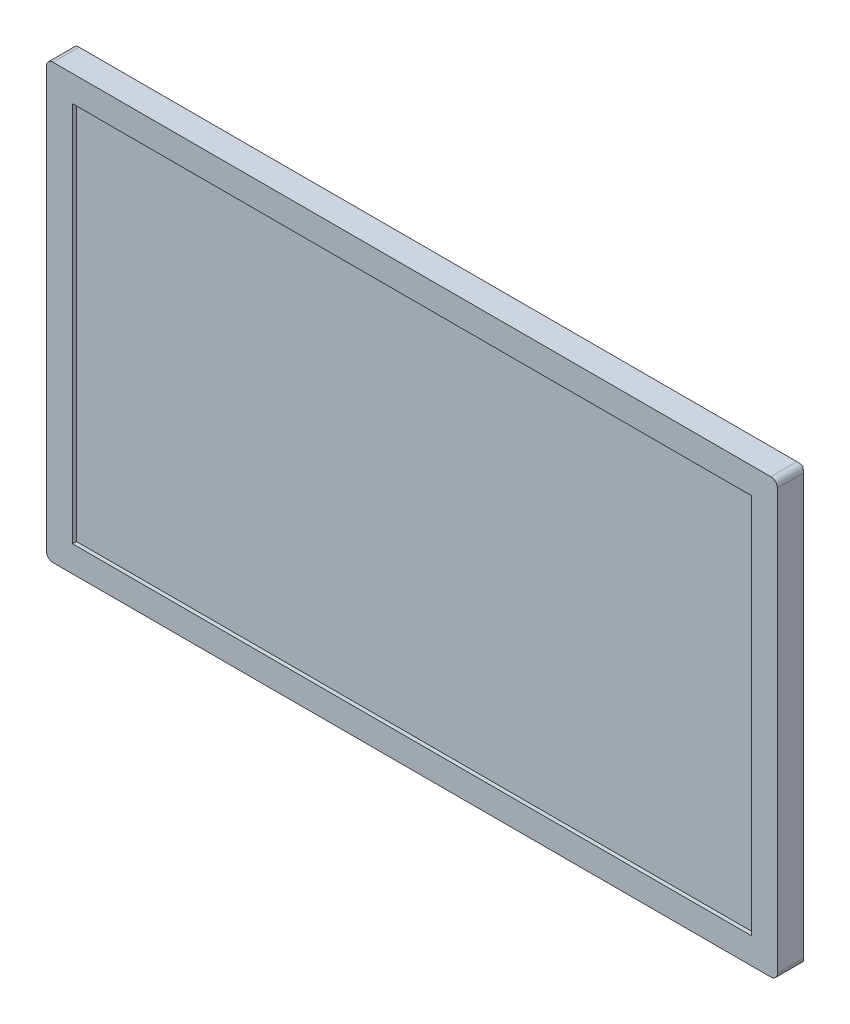
ISO-10303-21;
HEADER;
FILE_DESCRIPTION(('STEP AP214'),'2;1');
FILE_NAME('part.step','',(''),(''),'','','');
FILE_SCHEMA(('AUTOMOTIVE_DESIGN { 1 0 10303 214 1 1 1 1 }'));
ENDSEC;
DATA;
#1=APPLICATION_CONTEXT('core data for automotive mechanical design processes');
#2=APPLICATION_PROTOCOL_DEFINITION('international standard','automotive_design',2000,#1);
#3=PRODUCT_CONTEXT('',#1,'mechanical');
#4=PRODUCT('Part','Part','',(#3));
#5=PRODUCT_RELATED_PRODUCT_CATEGORY('part','',(#4));
#6=PRODUCT_DEFINITION_FORMATION('','',#4);
#7=PRODUCT_DEFINITION_CONTEXT('part definition',#1,'design');
#8=PRODUCT_DEFINITION('design','',#6,#7);
#9=PRODUCT_DEFINITION_SHAPE('','',#8);
#10=(LENGTH_UNIT() NAMED_UNIT(*) SI_UNIT(.MILLI.,.METRE.));
#11=(NAMED_UNIT(*) PLANE_ANGLE_UNIT() SI_UNIT($,.RADIAN.));
#12=(NAMED_UNIT(*) SI_UNIT($,.STERADIAN.) SOLID_ANGLE_UNIT());
#13=UNCERTAINTY_MEASURE_WITH_UNIT(LENGTH_MEASURE(1.E-05),#10,'distance_accuracy_value','');
#14=(GEOMETRIC_REPRESENTATION_CONTEXT(3) GLOBAL_UNCERTAINTY_ASSIGNED_CONTEXT((#13)) GLOBAL_UNIT_ASSIGNED_CONTEXT((#10,
#11,#12)) REPRESENTATION_CONTEXT('',''));
#15=CARTESIAN_POINT('',(0.,0.,0.));
#16=DIRECTION('',(0.,0.,1.));
#17=DIRECTION('',(1.,0.,0.));
#18=AXIS2_PLACEMENT_3D('',#15,#16,#17);
#19=CARTESIAN_POINT('',(4.24099625422855E-06,249.816192250166,87.3092256012788));
#20=DIRECTION('',(0.,0.,-1.));
#21=DIRECTION('',(0.,1.,0.));
#22=AXIS2_PLACEMENT_3D('',#19,#20,#21);
#23=PLANE('',#22);
#24=DIRECTION('',(0.,-1.,0.));
#25=VECTOR('',#24,1.);
#26=CARTESIAN_POINT('',(25.,201.522907005615,87.3092256012788));
#27=LINE('',#26,#25);
#28=CARTESIAN_POINT('',(25.,201.522907005615,87.3092256012788));
#29=VERTEX_POINT('',#28);
#30=CARTESIAN_POINT('',(25.0000000000001,121.522907005615,87.3092256012788));
#31=VERTEX_POINT('',#30);
#32=EDGE_CURVE('E53',#29,#31,#27,.T.);
#33=ORIENTED_EDGE('',*,*,#32,.F.);
#34=DIRECTION('',(1.,0.,0.));
#35=VECTOR('',#34,1.);
#36=CARTESIAN_POINT('',(25.,201.522907005615,87.3092256012788));
#37=LINE('',#36,#35);
#38=CARTESIAN_POINT('',(-25.,201.522907005615,87.3092256012788));
#39=VERTEX_POINT('',#38);
#40=EDGE_CURVE('E193',#39,#29,#37,.T.);
#41=ORIENTED_EDGE('',*,*,#40,.F.);
#42=DIRECTION('',(0.,1.,0.));
#43=VECTOR('',#42,1.);
#44=CARTESIAN_POINT('',(-25.,201.522907005615,87.3092256012788));
#45=LINE('',#44,#43);
#46=CARTESIAN_POINT('',(-25.,121.522907005615,87.3092256012788));
#47=VERTEX_POINT('',#46);
#48=EDGE_CURVE('E368',#47,#39,#45,.T.);
#49=ORIENTED_EDGE('',*,*,#48,.F.);
#50=DIRECTION('',(1.,0.,0.));
#51=VECTOR('',#50,1.);
#52=CARTESIAN_POINT('',(-314.999995759004,121.522907005615,87.3092256012789));
#53=LINE('',#52,#51);
#54=CARTESIAN_POINT('',(-256.543281003554,121.522907005615,87.3092256012789));
#55=VERTEX_POINT('',#54);
#56=EDGE_CURVE('E298',#55,#47,#53,.T.);
#57=ORIENTED_EDGE('',*,*,#56,.F.);
#58=DIRECTION('',(0.,1.,0.));
#59=VECTOR('',#58,1.);
#60=CARTESIAN_POINT('',(-256.543281003554,436.566192250166,87.3092256012789));
#61=LINE('',#60,#59);
#62=CARTESIAN_POINT('',(-256.543281003555,378.109477494716,87.3092256012789));
#63=VERTEX_POINT('',#62);
#64=EDGE_CURVE('E196',#63,#55,#61,.F.);
#65=ORIENTED_EDGE('',*,*,#64,.F.);
#66=DIRECTION('',(1.,0.,0.));
#67=VECTOR('',#66,1.);
#68=CARTESIAN_POINT('',(315.000004240996,378.109477494716,87.3092256012789));
#69=LINE('',#68,#67);
#70=CARTESIAN_POINT('',(256.543289485547,378.109477494716,87.3092256012789));
#71=VERTEX_POINT('',#70);
#72=EDGE_CURVE('E284',#71,#63,#69,.F.);
#73=ORIENTED_EDGE('',*,*,#72,.F.);
#74=DIRECTION('',(0.,1.,0.));
#75=VECTOR('',#74,1.);
#76=CARTESIAN_POINT('',(256.543289485547,63.0661922501656,87.3092256012789));
#77=LINE('',#76,#75);
#78=CARTESIAN_POINT('',(256.543289485547,121.522907005615,87.3092256012789));
#79=VERTEX_POINT('',#78);
#80=EDGE_CURVE('E290',#79,#71,#77,.T.);
#81=ORIENTED_EDGE('',*,*,#80,.F.);
#82=EDGE_CURVE('E39',#31,#79,#53,.T.);
#83=ORIENTED_EDGE('',*,*,#82,.F.);
#84=EDGE_LOOP('',(#33,#41,#49,#57,#65,#73,#81,#83));
#85=FACE_BOUND('',#84,.T.);
#86=ADVANCED_FACE('F36',(#85),#23,.T.);
#87=CARTESIAN_POINT('',(-314.999995759004,436.566192250166,121.059225601279));
#88=DIRECTION('',(-0.5,0.,-0.866025403784439));
#89=DIRECTION('',(-0.866025403784439,0.,0.5));
#90=AXIS2_PLACEMENT_3D('',#87,#88,#89);
#91=PLANE('',#90);
#92=CARTESIAN_POINT('',(-309.374995759004,68.6911922501657,117.811630337087));
#93=DIRECTION('',(-0.5,0.,-0.866025403784439));
#94=DIRECTION('',(-0.866025403784439,0.,0.5));
#95=AXIS2_PLACEMENT_3D('',#92,#93,#94);
#96=ELLIPSE('',#95,6.49519052838329,5.625);
#97=CARTESIAN_POINT('',(-314.999995759004,68.6911922501657,121.059225601279));
#98=VERTEX_POINT('',#97);
#99=CARTESIAN_POINT('',(-313.352471403178,64.7137166059914,120.108026970946));
#100=VERTEX_POINT('',#99);
#101=EDGE_CURVE('E275',#98,#100,#96,.F.);
#102=ORIENTED_EDGE('',*,*,#101,.F.);
#103=DIRECTION('',(0.,1.,0.));
#104=VECTOR('',#103,1.);
#105=CARTESIAN_POINT('',(-314.999995759004,249.816192250166,121.059225601279));
#106=LINE('',#105,#104);
#107=CARTESIAN_POINT('',(-314.999995759004,430.941192250166,121.059225601279));
#108=VERTEX_POINT('',#107);
#109=EDGE_CURVE('E276',#108,#98,#106,.F.);
#110=ORIENTED_EDGE('',*,*,#109,.F.);
#111=CARTESIAN_POINT('',(-309.374995759004,430.941192250166,117.811630337087));
#112=DIRECTION('',(-0.5,0.,-0.866025403784439));
#113=DIRECTION('',(0.866025403784439,0.,-0.5));
#114=AXIS2_PLACEMENT_3D('',#111,#112,#113);
#115=ELLIPSE('',#114,6.49519052838329,5.625);
#116=CARTESIAN_POINT('',(-313.352471403178,434.91866789434,120.108026970946));
#117=VERTEX_POINT('',#116);
#118=EDGE_CURVE('E283',#117,#108,#115,.F.);
#119=ORIENTED_EDGE('',*,*,#118,.F.);
#120=DIRECTION('',(-0.654653670707977,0.654653670707977,0.377964473009227));
#121=VECTOR('',#120,1.);
#122=CARTESIAN_POINT('',(-256.543281003555,378.109477494716,87.3092256012789));
#123=LINE('',#122,#121);
#124=EDGE_CURVE('E281',#63,#117,#123,.T.);
#125=ORIENTED_EDGE('',*,*,#124,.F.);
#126=ORIENTED_EDGE('',*,*,#64,.T.);
#127=DIRECTION('',(0.654653670707979,0.654653670707976,-0.377964473009226));
#128=VECTOR('',#127,1.);
#129=CARTESIAN_POINT('',(-313.352471403178,64.7137166059914,120.108026970946));
#130=LINE('',#129,#128);
#131=EDGE_CURVE('E199',#100,#55,#130,.T.);
#132=ORIENTED_EDGE('',*,*,#131,.F.);
#133=EDGE_LOOP('',(#102,#110,#119,#125,#126,#132));
#134=FACE_BOUND('',#133,.T.);
#135=ADVANCED_FACE('F345',(#134),#91,.T.);
#136=CARTESIAN_POINT('',(-314.999995759004,63.0661922501656,121.059225601279));
#137=DIRECTION('',(0.,-0.5,-0.866025403784439));
#138=DIRECTION('',(0.,0.866025403784439,-0.5));
#139=AXIS2_PLACEMENT_3D('',#136,#137,#138);
#140=PLANE('',#139);
#141=ORIENTED_EDGE('',*,*,#131,.T.);
#142=ORIENTED_EDGE('',*,*,#56,.T.);
#143=DIRECTION('',(-1.,0.,0.));
#144=VECTOR('',#143,1.);
#145=CARTESIAN_POINT('',(25.,121.522907005615,87.3092256012787));
#146=LINE('',#145,#144);
#147=EDGE_CURVE('E371',#31,#47,#146,.T.);
#148=ORIENTED_EDGE('',*,*,#147,.F.);
#149=ORIENTED_EDGE('',*,*,#82,.T.);
#150=DIRECTION('',(-0.654653670707978,0.654653670707976,-0.377964473009228));
#151=VECTOR('',#150,1.);
#152=CARTESIAN_POINT('',(313.352479885171,64.7137166059912,120.108026970946));
#153=LINE('',#152,#151);
#154=CARTESIAN_POINT('',(313.352479885171,64.7137166059913,120.108026970946));
#155=VERTEX_POINT('',#154);
#156=EDGE_CURVE('E295',#155,#79,#153,.T.);
#157=ORIENTED_EDGE('',*,*,#156,.F.);
#158=CARTESIAN_POINT('',(309.375004240996,68.6911922501657,117.811630337087));
#159=DIRECTION('',(0.,-0.5,-0.866025403784439));
#160=DIRECTION('',(0.,0.866025403784439,-0.5));
#161=AXIS2_PLACEMENT_3D('',#158,#159,#160);
#162=ELLIPSE('',#161,6.49519052838329,5.625);
#163=CARTESIAN_POINT('',(309.375004240996,63.0661922501656,121.059225601279));
#164=VERTEX_POINT('',#163);
#165=EDGE_CURVE('E262',#164,#155,#162,.F.);
#166=ORIENTED_EDGE('',*,*,#165,.F.);
#167=DIRECTION('',(1.,0.,0.));
#168=VECTOR('',#167,1.);
#169=CARTESIAN_POINT('',(4.24099625422855E-06,63.0661922501656,121.059225601279));
#170=LINE('',#169,#168);
#171=CARTESIAN_POINT('',(-309.374995759004,63.0661922501656,121.059225601279));
#172=VERTEX_POINT('',#171);
#173=EDGE_CURVE('E270',#172,#164,#170,.T.);
#174=ORIENTED_EDGE('',*,*,#173,.F.);
#175=CARTESIAN_POINT('',(-309.374995759004,68.6911922501657,117.811630337087));
#176=DIRECTION('',(0.,-0.5,-0.866025403784439));
#177=DIRECTION('',(0.,-0.866025403784439,0.5));
#178=AXIS2_PLACEMENT_3D('',#175,#176,#177);
#179=ELLIPSE('',#178,6.49519052838329,5.625);
#180=EDGE_CURVE('E271',#100,#172,#179,.F.);
#181=ORIENTED_EDGE('',*,*,#180,.F.);
#182=EDGE_LOOP('',(#141,#142,#148,#149,#157,#166,#174,#181));
#183=FACE_BOUND('',#182,.T.);
#184=ADVANCED_FACE('F370',(#183),#140,.T.);
#185=CARTESIAN_POINT('',(315.000004240996,63.0661922501656,121.059225601279));
#186=DIRECTION('',(0.5,0.,-0.866025403784439));
#187=DIRECTION('',(-0.866025403784439,0.,-0.5));
#188=AXIS2_PLACEMENT_3D('',#185,#186,#187);
#189=PLANE('',#188);
#190=CARTESIAN_POINT('',(309.375004240996,430.941192250166,117.811630337087));
#191=DIRECTION('',(0.5,0.,-0.866025403784439));
#192=DIRECTION('',(0.866025403784439,0.,0.5));
#193=AXIS2_PLACEMENT_3D('',#190,#191,#192);
#194=ELLIPSE('',#193,6.49519052838329,5.625);
#195=CARTESIAN_POINT('',(315.000004240996,430.941192250166,121.059225601279));
#196=VERTEX_POINT('',#195);
#197=CARTESIAN_POINT('',(313.352479885171,434.91866789434,120.108026970946));
#198=VERTEX_POINT('',#197);
#199=EDGE_CURVE('E257',#196,#198,#194,.F.);
#200=ORIENTED_EDGE('',*,*,#199,.F.);
#201=DIRECTION('',(0.,1.,0.));
#202=VECTOR('',#201,1.);
#203=CARTESIAN_POINT('',(315.000004240996,249.816192250166,121.059225601279));
#204=LINE('',#203,#202);
#205=CARTESIAN_POINT('',(315.000004240996,68.6911922501657,121.059225601279));
#206=VERTEX_POINT('',#205);
#207=EDGE_CURVE('E258',#206,#196,#204,.T.);
#208=ORIENTED_EDGE('',*,*,#207,.F.);
#209=CARTESIAN_POINT('',(309.375004240996,68.6911922501657,117.811630337087));
#210=DIRECTION('',(0.5,0.,-0.866025403784439));
#211=DIRECTION('',(-0.866025403784439,0.,-0.5));
#212=AXIS2_PLACEMENT_3D('',#209,#210,#211);
#213=ELLIPSE('',#212,6.49519052838329,5.625);
#214=EDGE_CURVE('E266',#155,#206,#213,.F.);
#215=ORIENTED_EDGE('',*,*,#214,.F.);
#216=ORIENTED_EDGE('',*,*,#156,.T.);
#217=ORIENTED_EDGE('',*,*,#80,.T.);
#218=DIRECTION('',(-0.654653670707978,-0.654653670707977,-0.377964473009227));
#219=VECTOR('',#218,1.);
#220=CARTESIAN_POINT('',(313.352479885171,434.91866789434,120.108026970946));
#221=LINE('',#220,#219);
#222=EDGE_CURVE('E287',#198,#71,#221,.T.);
#223=ORIENTED_EDGE('',*,*,#222,.F.);
#224=EDGE_LOOP('',(#200,#208,#215,#216,#217,#223));
#225=FACE_BOUND('',#224,.T.);
#226=ADVANCED_FACE('F450',(#225),#189,.T.);
#227=CARTESIAN_POINT('',(315.000004240996,436.566192250166,121.059225601279));
#228=DIRECTION('',(0.,0.5,-0.866025403784439));
#229=DIRECTION('',(0.,0.866025403784439,0.5));
#230=AXIS2_PLACEMENT_3D('',#227,#228,#229);
#231=PLANE('',#230);
#232=ORIENTED_EDGE('',*,*,#72,.T.);
#233=ORIENTED_EDGE('',*,*,#124,.T.);
#234=CARTESIAN_POINT('',(-309.374995759004,430.941192250166,117.811630337087));
#235=DIRECTION('',(0.,0.5,-0.866025403784439));
#236=DIRECTION('',(0.,-0.866025403784439,-0.5));
#237=AXIS2_PLACEMENT_3D('',#234,#235,#236);
#238=ELLIPSE('',#237,6.49519052838329,5.625);
#239=CARTESIAN_POINT('',(-309.374995759004,436.566192250166,121.059225601279));
#240=VERTEX_POINT('',#239);
#241=EDGE_CURVE('E280',#240,#117,#238,.F.);
#242=ORIENTED_EDGE('',*,*,#241,.F.);
#243=DIRECTION('',(1.,0.,0.));
#244=VECTOR('',#243,1.);
#245=CARTESIAN_POINT('',(4.24099625422855E-06,436.566192250166,121.059225601279));
#246=LINE('',#245,#244);
#247=CARTESIAN_POINT('',(309.375004240996,436.566192250166,121.059225601279));
#248=VERTEX_POINT('',#247);
#249=EDGE_CURVE('E250',#248,#240,#246,.F.);
#250=ORIENTED_EDGE('',*,*,#249,.F.);
#251=CARTESIAN_POINT('',(309.375004240996,430.941192250166,117.811630337087));
#252=DIRECTION('',(0.,0.5,-0.866025403784439));
#253=DIRECTION('',(0.,0.866025403784439,0.5));
#254=AXIS2_PLACEMENT_3D('',#251,#252,#253);
#255=ELLIPSE('',#254,6.49519052838329,5.625);
#256=EDGE_CURVE('E253',#198,#248,#255,.F.);
#257=ORIENTED_EDGE('',*,*,#256,.F.);
#258=ORIENTED_EDGE('',*,*,#222,.T.);
#259=EDGE_LOOP('',(#232,#233,#242,#250,#257,#258));
#260=FACE_BOUND('',#259,.T.);
#261=ADVANCED_FACE('F363',(#260),#231,.T.);
#262=CARTESIAN_POINT('',(-309.374995759004,430.941192250166,126.684225601279));
#263=DIRECTION('',(0.,0.,-1.));
#264=DIRECTION('',(-1.,0.,0.));
#265=AXIS2_PLACEMENT_3D('',#262,#263,#264);
#266=CYLINDRICAL_SURFACE('',#265,5.625);
#267=DIRECTION('',(0.,0.,1.));
#268=VECTOR('',#267,1.);
#269=CARTESIAN_POINT('',(-309.374995759004,436.566192250166,121.059225601279));
#270=LINE('',#269,#268);
#271=CARTESIAN_POINT('',(-309.374995759004,436.566192250166,143.559225601279));
#272=VERTEX_POINT('',#271);
#273=EDGE_CURVE('E251',#240,#272,#270,.T.);
#274=ORIENTED_EDGE('',*,*,#273,.F.);
#275=ORIENTED_EDGE('',*,*,#241,.T.);
#276=ORIENTED_EDGE('',*,*,#118,.T.);
#277=DIRECTION('',(0.,0.,1.));
#278=VECTOR('',#277,1.);
#279=CARTESIAN_POINT('',(-314.999995759004,430.941192250166,132.309225601279));
#280=LINE('',#279,#278);
#281=CARTESIAN_POINT('',(-314.999995759004,430.941192250166,143.559225601279));
#282=VERTEX_POINT('',#281);
#283=EDGE_CURVE('E277',#282,#108,#280,.F.);
#284=ORIENTED_EDGE('',*,*,#283,.F.);
#285=CARTESIAN_POINT('',(-309.374995759004,430.941192250166,143.559225601279));
#286=DIRECTION('',(0.,0.,-1.));
#287=DIRECTION('',(-1.,0.,0.));
#288=AXIS2_PLACEMENT_3D('',#285,#286,#287);
#289=CIRCLE('',#288,5.625);
#290=EDGE_CURVE('E246',#272,#282,#289,.F.);
#291=ORIENTED_EDGE('',*,*,#290,.F.);
#292=EDGE_LOOP('',(#274,#275,#276,#284,#291));
#293=FACE_BOUND('',#292,.T.);
#294=ADVANCED_FACE('F335',(#293),#266,.T.);
#295=CARTESIAN_POINT('',(-314.999995759004,249.816192250166,132.309225601279));
#296=DIRECTION('',(-1.,0.,0.));
#297=DIRECTION('',(0.,0.,1.));
#298=AXIS2_PLACEMENT_3D('',#295,#296,#297);
#299=PLANE('',#298);
#300=DIRECTION('',(0.,0.,1.));
#301=VECTOR('',#300,1.);
#302=CARTESIAN_POINT('',(-314.999995759004,68.6911922501656,137.934225601279));
#303=LINE('',#302,#301);
#304=CARTESIAN_POINT('',(-314.999995759004,68.6911922501657,143.559225601279));
#305=VERTEX_POINT('',#304);
#306=EDGE_CURVE('E272',#305,#98,#303,.F.);
#307=ORIENTED_EDGE('',*,*,#306,.F.);
#308=DIRECTION('',(0.,1.,0.));
#309=VECTOR('',#308,1.);
#310=CARTESIAN_POINT('',(-314.999995759004,436.566192250166,143.559225601279));
#311=LINE('',#310,#309);
#312=EDGE_CURVE('E244',#282,#305,#311,.F.);
#313=ORIENTED_EDGE('',*,*,#312,.F.);
#314=ORIENTED_EDGE('',*,*,#283,.T.);
#315=ORIENTED_EDGE('',*,*,#109,.T.);
#316=EDGE_LOOP('',(#307,#313,#314,#315));
#317=FACE_BOUND('',#316,.T.);
#318=ADVANCED_FACE('F343',(#317),#299,.T.);
#319=CARTESIAN_POINT('',(-309.374995759004,68.6911922501656,137.934225601279));
#320=DIRECTION('',(0.,0.,1.));
#321=DIRECTION('',(0.,-1.,0.));
#322=AXIS2_PLACEMENT_3D('',#319,#320,#321);
#323=CYLINDRICAL_SURFACE('',#322,5.625);
#324=ORIENTED_EDGE('',*,*,#180,.T.);
#325=DIRECTION('',(0.,0.,-1.));
#326=VECTOR('',#325,1.);
#327=CARTESIAN_POINT('',(-309.374995759004,63.0661922501656,143.559225601279));
#328=LINE('',#327,#326);
#329=CARTESIAN_POINT('',(-309.374995759004,63.0661922501656,143.559225601279));
#330=VERTEX_POINT('',#329);
#331=EDGE_CURVE('E267',#330,#172,#328,.T.);
#332=ORIENTED_EDGE('',*,*,#331,.F.);
#333=CARTESIAN_POINT('',(-309.374995759004,68.6911922501656,143.559225601279));
#334=DIRECTION('',(0.,0.,1.));
#335=DIRECTION('',(0.,-1.,0.));
#336=AXIS2_PLACEMENT_3D('',#333,#334,#335);
#337=CIRCLE('',#336,5.625);
#338=EDGE_CURVE('E243',#305,#330,#337,.T.);
#339=ORIENTED_EDGE('',*,*,#338,.F.);
#340=ORIENTED_EDGE('',*,*,#306,.T.);
#341=ORIENTED_EDGE('',*,*,#101,.T.);
#342=EDGE_LOOP('',(#324,#332,#339,#340,#341));
#343=FACE_BOUND('',#342,.T.);
#344=ADVANCED_FACE('F349',(#343),#323,.T.);
#345=CARTESIAN_POINT('',(4.24099625422855E-06,63.0661922501656,143.559225601279));
#346=DIRECTION('',(0.,-1.,0.));
#347=DIRECTION('',(0.,0.,-1.));
#348=AXIS2_PLACEMENT_3D('',#345,#346,#347);
#349=PLANE('',#348);
#350=DIRECTION('',(0.,0.,-1.));
#351=VECTOR('',#350,1.);
#352=CARTESIAN_POINT('',(309.375004240996,63.0661922501656,137.934225601279));
#353=LINE('',#352,#351);
#354=CARTESIAN_POINT('',(309.375004240996,63.0661922501656,143.559225601279));
#355=VERTEX_POINT('',#354);
#356=EDGE_CURVE('E263',#355,#164,#353,.T.);
#357=ORIENTED_EDGE('',*,*,#356,.F.);
#358=DIRECTION('',(1.,0.,0.));
#359=VECTOR('',#358,1.);
#360=CARTESIAN_POINT('',(4.24099625422855E-06,63.0661922501656,143.559225601279));
#361=LINE('',#360,#359);
#362=EDGE_CURVE('E241',#330,#355,#361,.T.);
#363=ORIENTED_EDGE('',*,*,#362,.F.);
#364=ORIENTED_EDGE('',*,*,#331,.T.);
#365=ORIENTED_EDGE('',*,*,#173,.T.);
#366=EDGE_LOOP('',(#357,#363,#364,#365));
#367=FACE_BOUND('',#366,.T.);
#368=ADVANCED_FACE('F437',(#367),#349,.T.);
#369=CARTESIAN_POINT('',(309.375004240996,68.6911922501656,137.934225601279));
#370=DIRECTION('',(0.,0.,-1.));
#371=DIRECTION('',(0.,1.,0.));
#372=AXIS2_PLACEMENT_3D('',#369,#370,#371);
#373=CYLINDRICAL_SURFACE('',#372,5.625);
#374=ORIENTED_EDGE('',*,*,#356,.T.);
#375=ORIENTED_EDGE('',*,*,#165,.T.);
#376=ORIENTED_EDGE('',*,*,#214,.T.);
#377=DIRECTION('',(0.,0.,-1.));
#378=VECTOR('',#377,1.);
#379=CARTESIAN_POINT('',(315.000004240996,68.6911922501657,132.309225601279));
#380=LINE('',#379,#378);
#381=CARTESIAN_POINT('',(315.000004240996,68.6911922501657,143.559225601279));
#382=VERTEX_POINT('',#381);
#383=EDGE_CURVE('E259',#382,#206,#380,.T.);
#384=ORIENTED_EDGE('',*,*,#383,.F.);
#385=CARTESIAN_POINT('',(309.375004240996,68.6911922501656,143.559225601279));
#386=DIRECTION('',(0.,0.,-1.));
#387=DIRECTION('',(0.,1.,0.));
#388=AXIS2_PLACEMENT_3D('',#385,#386,#387);
#389=CIRCLE('',#388,5.625);
#390=EDGE_CURVE('E240',#355,#382,#389,.F.);
#391=ORIENTED_EDGE('',*,*,#390,.F.);
#392=EDGE_LOOP('',(#374,#375,#376,#384,#391));
#393=FACE_BOUND('',#392,.T.);
#394=ADVANCED_FACE('F433',(#393),#373,.T.);
#395=CARTESIAN_POINT('',(315.000004240996,249.816192250166,132.309225601279));
#396=DIRECTION('',(1.,0.,0.));
#397=DIRECTION('',(0.,0.,-1.));
#398=AXIS2_PLACEMENT_3D('',#395,#396,#397);
#399=PLANE('',#398);
#400=DIRECTION('',(0.,0.,1.));
#401=VECTOR('',#400,1.);
#402=CARTESIAN_POINT('',(315.000004240996,430.941192250166,126.684225601279));
#403=LINE('',#402,#401);
#404=CARTESIAN_POINT('',(315.000004240996,430.941192250166,143.559225601279));
#405=VERTEX_POINT('',#404);
#406=EDGE_CURVE('E254',#405,#196,#403,.F.);
#407=ORIENTED_EDGE('',*,*,#406,.F.);
#408=DIRECTION('',(0.,1.,0.));
#409=VECTOR('',#408,1.);
#410=CARTESIAN_POINT('',(315.000004240996,436.566192250166,143.559225601279));
#411=LINE('',#410,#409);
#412=EDGE_CURVE('E238',#382,#405,#411,.T.);
#413=ORIENTED_EDGE('',*,*,#412,.F.);
#414=ORIENTED_EDGE('',*,*,#383,.T.);
#415=ORIENTED_EDGE('',*,*,#207,.T.);
#416=EDGE_LOOP('',(#407,#413,#414,#415));
#417=FACE_BOUND('',#416,.T.);
#418=ADVANCED_FACE('F429',(#417),#399,.T.);
#419=CARTESIAN_POINT('',(309.375004240996,430.941192250166,126.684225601279));
#420=DIRECTION('',(0.,0.,1.));
#421=DIRECTION('',(1.,0.,0.));
#422=AXIS2_PLACEMENT_3D('',#419,#420,#421);
#423=CYLINDRICAL_SURFACE('',#422,5.625);
#424=ORIENTED_EDGE('',*,*,#256,.T.);
#425=DIRECTION('',(0.,0.,1.));
#426=VECTOR('',#425,1.);
#427=CARTESIAN_POINT('',(309.375004240996,436.566192250166,121.059225601279));
#428=LINE('',#427,#426);
#429=CARTESIAN_POINT('',(309.375004240996,436.566192250166,143.559225601279));
#430=VERTEX_POINT('',#429);
#431=EDGE_CURVE('E247',#430,#248,#428,.F.);
#432=ORIENTED_EDGE('',*,*,#431,.F.);
#433=CARTESIAN_POINT('',(309.375004240996,430.941192250166,143.559225601279));
#434=DIRECTION('',(0.,0.,1.));
#435=DIRECTION('',(1.,0.,0.));
#436=AXIS2_PLACEMENT_3D('',#433,#434,#435);
#437=CIRCLE('',#436,5.625);
#438=EDGE_CURVE('E237',#405,#430,#437,.T.);
#439=ORIENTED_EDGE('',*,*,#438,.F.);
#440=ORIENTED_EDGE('',*,*,#406,.T.);
#441=ORIENTED_EDGE('',*,*,#199,.T.);
#442=EDGE_LOOP('',(#424,#432,#439,#440,#441));
#443=FACE_BOUND('',#442,.T.);
#444=ADVANCED_FACE('F426',(#443),#423,.T.);
#445=CARTESIAN_POINT('',(4.24099625422855E-06,436.566192250166,121.059225601279));
#446=DIRECTION('',(0.,1.,0.));
#447=DIRECTION('',(0.,0.,1.));
#448=AXIS2_PLACEMENT_3D('',#445,#446,#447);
#449=PLANE('',#448);
#450=ORIENTED_EDGE('',*,*,#431,.T.);
#451=ORIENTED_EDGE('',*,*,#249,.T.);
#452=ORIENTED_EDGE('',*,*,#273,.T.);
#453=DIRECTION('',(1.,0.,0.));
#454=VECTOR('',#453,1.);
#455=CARTESIAN_POINT('',(4.24099625422855E-06,436.566192250166,143.559225601279));
#456=LINE('',#455,#454);
#457=EDGE_CURVE('E234',#430,#272,#456,.F.);
#458=ORIENTED_EDGE('',*,*,#457,.F.);
#459=EDGE_LOOP('',(#450,#451,#452,#458));
#460=FACE_BOUND('',#459,.T.);
#461=ADVANCED_FACE('F358',(#460),#449,.T.);
#462=CARTESIAN_POINT('',(4.24099625422855E-06,436.566192250166,143.559225601279));
#463=DIRECTION('',(0.,0.,1.));
#464=DIRECTION('',(1.,0.,0.));
#465=AXIS2_PLACEMENT_3D('',#462,#463,#464);
#466=PLANE('',#465);
#467=DIRECTION('',(0.,1.,0.));
#468=VECTOR('',#467,1.);
#469=CARTESIAN_POINT('',(292.500004240996,414.066192250166,143.559225601279));
#470=LINE('',#469,#468);
#471=CARTESIAN_POINT('',(292.500004240996,414.066192250166,143.559225601279));
#472=VERTEX_POINT('',#471);
#473=CARTESIAN_POINT('',(292.500004240996,85.5661922501656,143.559225601279));
#474=VERTEX_POINT('',#473);
#475=EDGE_CURVE('E232',#472,#474,#470,.F.);
#476=ORIENTED_EDGE('',*,*,#475,.T.);
#477=DIRECTION('',(1.,0.,0.));
#478=VECTOR('',#477,1.);
#479=CARTESIAN_POINT('',(292.500004240996,85.5661922501656,143.559225601279));
#480=LINE('',#479,#478);
#481=CARTESIAN_POINT('',(-292.499995759004,85.5661922501656,143.559225601279));
#482=VERTEX_POINT('',#481);
#483=EDGE_CURVE('E227',#474,#482,#480,.F.);
#484=ORIENTED_EDGE('',*,*,#483,.T.);
#485=DIRECTION('',(0.,1.,0.));
#486=VECTOR('',#485,1.);
#487=CARTESIAN_POINT('',(-292.499995759004,85.5661922501656,143.559225601279));
#488=LINE('',#487,#486);
#489=CARTESIAN_POINT('',(-292.499995759004,414.066192250166,143.559225601279));
#490=VERTEX_POINT('',#489);
#491=EDGE_CURVE('E222',#482,#490,#488,.T.);
#492=ORIENTED_EDGE('',*,*,#491,.T.);
#493=DIRECTION('',(-1.,0.,0.));
#494=VECTOR('',#493,1.);
#495=CARTESIAN_POINT('',(-292.499995759004,414.066192250166,143.559225601279));
#496=LINE('',#495,#494);
#497=EDGE_CURVE('E213',#490,#472,#496,.F.);
#498=ORIENTED_EDGE('',*,*,#497,.T.);
#499=EDGE_LOOP('',(#476,#484,#492,#498));
#500=FACE_BOUND('',#499,.T.);
#501=ORIENTED_EDGE('',*,*,#438,.T.);
#502=ORIENTED_EDGE('',*,*,#457,.T.);
#503=ORIENTED_EDGE('',*,*,#290,.T.);
#504=ORIENTED_EDGE('',*,*,#312,.T.);
#505=ORIENTED_EDGE('',*,*,#338,.T.);
#506=ORIENTED_EDGE('',*,*,#362,.T.);
#507=ORIENTED_EDGE('',*,*,#390,.T.);
#508=ORIENTED_EDGE('',*,*,#412,.T.);
#509=EDGE_LOOP('',(#501,#502,#503,#504,#505,#506,#507,#508));
#510=FACE_BOUND('',#509,.T.);
#511=ADVANCED_FACE('F354',(#500,#510),#466,.T.);
#512=CARTESIAN_POINT('',(292.500004240996,414.066192250166,143.559225601279));
#513=DIRECTION('',(1.,0.,0.));
#514=DIRECTION('',(0.,0.,-1.));
#515=AXIS2_PLACEMENT_3D('',#512,#513,#514);
#516=PLANE('',#515);
#517=DIRECTION('',(0.,0.,1.));
#518=VECTOR('',#517,1.);
#519=CARTESIAN_POINT('',(292.500004240996,414.066192250166,143.559225601279));
#520=LINE('',#519,#518);
#521=CARTESIAN_POINT('',(292.500004240996,414.066192250166,140.184225601279));
#522=VERTEX_POINT('',#521);
#523=EDGE_CURVE('E219',#472,#522,#520,.F.);
#524=ORIENTED_EDGE('',*,*,#523,.T.);
#525=DIRECTION('',(0.,1.,0.));
#526=VECTOR('',#525,1.);
#527=CARTESIAN_POINT('',(292.500004240996,249.816192250166,140.184225601279));
#528=LINE('',#527,#526);
#529=CARTESIAN_POINT('',(292.500004240996,85.5661922501656,140.184225601279));
#530=VERTEX_POINT('',#529);
#531=EDGE_CURVE('E210',#522,#530,#528,.F.);
#532=ORIENTED_EDGE('',*,*,#531,.T.);
#533=DIRECTION('',(0.,0.,1.));
#534=VECTOR('',#533,1.);
#535=CARTESIAN_POINT('',(292.500004240996,85.5661922501656,143.559225601279));
#536=LINE('',#535,#534);
#537=EDGE_CURVE('E229',#530,#474,#536,.T.);
#538=ORIENTED_EDGE('',*,*,#537,.T.);
#539=ORIENTED_EDGE('',*,*,#475,.F.);
#540=EDGE_LOOP('',(#524,#532,#538,#539));
#541=FACE_BOUND('',#540,.T.);
#542=ADVANCED_FACE('F416',(#541),#516,.F.);
#543=CARTESIAN_POINT('',(292.500004240996,85.5661922501656,143.559225601279));
#544=DIRECTION('',(0.,-1.,0.));
#545=DIRECTION('',(1.,0.,0.));
#546=AXIS2_PLACEMENT_3D('',#543,#544,#545);
#547=PLANE('',#546);
#548=ORIENTED_EDGE('',*,*,#537,.F.);
#549=DIRECTION('',(-1.,0.,0.));
#550=VECTOR('',#549,1.);
#551=CARTESIAN_POINT('',(4.24099625422855E-06,85.5661922501656,140.184225601279));
#552=LINE('',#551,#550);
#553=CARTESIAN_POINT('',(-292.499995759004,85.5661922501656,140.184225601279));
#554=VERTEX_POINT('',#553);
#555=EDGE_CURVE('E207',#530,#554,#552,.T.);
#556=ORIENTED_EDGE('',*,*,#555,.T.);
#557=DIRECTION('',(0.,0.,1.));
#558=VECTOR('',#557,1.);
#559=CARTESIAN_POINT('',(-292.499995759004,85.5661922501656,143.559225601279));
#560=LINE('',#559,#558);
#561=EDGE_CURVE('E224',#554,#482,#560,.T.);
#562=ORIENTED_EDGE('',*,*,#561,.T.);
#563=ORIENTED_EDGE('',*,*,#483,.F.);
#564=EDGE_LOOP('',(#548,#556,#562,#563));
#565=FACE_BOUND('',#564,.T.);
#566=ADVANCED_FACE('F412',(#565),#547,.F.);
#567=CARTESIAN_POINT('',(-292.499995759004,85.5661922501656,143.559225601279));
#568=DIRECTION('',(-1.,0.,0.));
#569=DIRECTION('',(0.,0.,1.));
#570=AXIS2_PLACEMENT_3D('',#567,#568,#569);
#571=PLANE('',#570);
#572=ORIENTED_EDGE('',*,*,#561,.F.);
#573=DIRECTION('',(0.,1.,0.));
#574=VECTOR('',#573,1.);
#575=CARTESIAN_POINT('',(-292.499995759004,249.816192250166,140.184225601279));
#576=LINE('',#575,#574);
#577=CARTESIAN_POINT('',(-292.499995759004,414.066192250166,140.184225601279));
#578=VERTEX_POINT('',#577);
#579=EDGE_CURVE('E45',#554,#578,#576,.T.);
#580=ORIENTED_EDGE('',*,*,#579,.T.);
#581=DIRECTION('',(0.,0.,1.));
#582=VECTOR('',#581,1.);
#583=CARTESIAN_POINT('',(-292.499995759004,414.066192250166,143.559225601279));
#584=LINE('',#583,#582);
#585=EDGE_CURVE('E216',#578,#490,#584,.T.);
#586=ORIENTED_EDGE('',*,*,#585,.T.);
#587=ORIENTED_EDGE('',*,*,#491,.F.);
#588=EDGE_LOOP('',(#572,#580,#586,#587));
#589=FACE_BOUND('',#588,.T.);
#590=ADVANCED_FACE('F404',(#589),#571,.F.);
#591=CARTESIAN_POINT('',(-292.499995759004,414.066192250166,143.559225601279));
#592=DIRECTION('',(0.,1.,0.));
#593=DIRECTION('',(-1.,0.,0.));
#594=AXIS2_PLACEMENT_3D('',#591,#592,#593);
#595=PLANE('',#594);
#596=ORIENTED_EDGE('',*,*,#585,.F.);
#597=DIRECTION('',(-1.,0.,0.));
#598=VECTOR('',#597,1.);
#599=CARTESIAN_POINT('',(4.24099625422855E-06,414.066192250166,140.184225601279));
#600=LINE('',#599,#598);
#601=EDGE_CURVE('E11',#578,#522,#600,.F.);
#602=ORIENTED_EDGE('',*,*,#601,.T.);
#603=ORIENTED_EDGE('',*,*,#523,.F.);
#604=ORIENTED_EDGE('',*,*,#497,.F.);
#605=EDGE_LOOP('',(#596,#602,#603,#604));
#606=FACE_BOUND('',#605,.T.);
#607=ADVANCED_FACE('F396',(#606),#595,.F.);
#608=CARTESIAN_POINT('',(4.24099625422855E-06,249.816192250166,140.184225601279));
#609=DIRECTION('',(0.,0.,-1.));
#610=DIRECTION('',(-1.,0.,0.));
#611=AXIS2_PLACEMENT_3D('',#608,#609,#610);
#612=PLANE('',#611);
#613=ORIENTED_EDGE('',*,*,#579,.F.);
#614=ORIENTED_EDGE('',*,*,#555,.F.);
#615=ORIENTED_EDGE('',*,*,#531,.F.);
#616=ORIENTED_EDGE('',*,*,#601,.F.);
#617=EDGE_LOOP('',(#613,#614,#615,#616));
#618=FACE_BOUND('',#617,.T.);
#619=ADVANCED_FACE('F394',(#618),#612,.F.);
#620=CARTESIAN_POINT('',(25.,201.522907005615,7.30922560127875));
#621=DIRECTION('',(-1.,0.,0.));
#622=DIRECTION('',(0.,-1.,0.));
#623=AXIS2_PLACEMENT_3D('',#620,#621,#622);
#624=PLANE('',#623);
#625=ORIENTED_EDGE('',*,*,#32,.T.);
#626=DIRECTION('',(0.,0.,1.));
#627=VECTOR('',#626,1.);
#628=CARTESIAN_POINT('',(25.,121.522907005615,7.30922560127874));
#629=LINE('',#628,#627);
#630=CARTESIAN_POINT('',(25.,121.522907005615,7.30922560127874));
#631=VERTEX_POINT('',#630);
#632=EDGE_CURVE('E178',#631,#31,#629,.T.);
#633=ORIENTED_EDGE('',*,*,#632,.F.);
#634=DIRECTION('',(0.,-1.,0.));
#635=VECTOR('',#634,1.);
#636=CARTESIAN_POINT('',(25.,201.522907005615,7.30922560127875));
#637=LINE('',#636,#635);
#638=CARTESIAN_POINT('',(25.,201.522907005615,7.30922560127875));
#639=VERTEX_POINT('',#638);
#640=EDGE_CURVE('E184',#639,#631,#637,.T.);
#641=ORIENTED_EDGE('',*,*,#640,.F.);
#642=DIRECTION('',(0.,0.,1.));
#643=VECTOR('',#642,1.);
#644=CARTESIAN_POINT('',(25.,201.522907005615,7.30922560127875));
#645=LINE('',#644,#643);
#646=EDGE_CURVE('E378',#639,#29,#645,.T.);
#647=ORIENTED_EDGE('',*,*,#646,.T.);
#648=EDGE_LOOP('',(#625,#633,#641,#647));
#649=FACE_BOUND('',#648,.T.);
#650=ADVANCED_FACE('F195',(#649),#624,.F.);
#651=CARTESIAN_POINT('',(25.,121.522907005615,7.30922560127874));
#652=DIRECTION('',(0.,1.,0.));
#653=DIRECTION('',(0.,0.,1.));
#654=AXIS2_PLACEMENT_3D('',#651,#652,#653);
#655=PLANE('',#654);
#656=ORIENTED_EDGE('',*,*,#147,.T.);
#657=DIRECTION('',(0.,0.,1.));
#658=VECTOR('',#657,1.);
#659=CARTESIAN_POINT('',(-25.,121.522907005615,7.30922560127874));
#660=LINE('',#659,#658);
#661=CARTESIAN_POINT('',(-25.,121.522907005615,7.30922560127874));
#662=VERTEX_POINT('',#661);
#663=EDGE_CURVE('E180',#662,#47,#660,.T.);
#664=ORIENTED_EDGE('',*,*,#663,.F.);
#665=DIRECTION('',(-1.,0.,0.));
#666=VECTOR('',#665,1.);
#667=CARTESIAN_POINT('',(25.,121.522907005615,7.30922560127874));
#668=LINE('',#667,#666);
#669=EDGE_CURVE('E173',#631,#662,#668,.T.);
#670=ORIENTED_EDGE('',*,*,#669,.F.);
#671=ORIENTED_EDGE('',*,*,#632,.T.);
#672=EDGE_LOOP('',(#656,#664,#670,#671));
#673=FACE_BOUND('',#672,.T.);
#674=ADVANCED_FACE('F176',(#673),#655,.F.);
#675=CARTESIAN_POINT('',(-25.,201.522907005615,7.30922560127875));
#676=DIRECTION('',(1.,0.,0.));
#677=DIRECTION('',(0.,1.,0.));
#678=AXIS2_PLACEMENT_3D('',#675,#676,#677);
#679=PLANE('',#678);
#680=ORIENTED_EDGE('',*,*,#48,.T.);
#681=DIRECTION('',(0.,0.,1.));
#682=VECTOR('',#681,1.);
#683=CARTESIAN_POINT('',(-25.,201.522907005615,7.30922560127875));
#684=LINE('',#683,#682);
#685=CARTESIAN_POINT('',(-25.,201.522907005615,7.30922560127875));
#686=VERTEX_POINT('',#685);
#687=EDGE_CURVE('E201',#686,#39,#684,.T.);
#688=ORIENTED_EDGE('',*,*,#687,.F.);
#689=DIRECTION('',(0.,1.,0.));
#690=VECTOR('',#689,1.);
#691=CARTESIAN_POINT('',(-25.,201.522907005615,7.30922560127875));
#692=LINE('',#691,#690);
#693=EDGE_CURVE('E183',#662,#686,#692,.T.);
#694=ORIENTED_EDGE('',*,*,#693,.F.);
#695=ORIENTED_EDGE('',*,*,#663,.T.);
#696=EDGE_LOOP('',(#680,#688,#694,#695));
#697=FACE_BOUND('',#696,.T.);
#698=ADVANCED_FACE('F374',(#697),#679,.F.);
#699=CARTESIAN_POINT('',(25.,201.522907005615,7.30922560127875));
#700=DIRECTION('',(0.,-1.,0.));
#701=DIRECTION('',(1.,0.,0.));
#702=AXIS2_PLACEMENT_3D('',#699,#700,#701);
#703=PLANE('',#702);
#704=ORIENTED_EDGE('',*,*,#40,.T.);
#705=ORIENTED_EDGE('',*,*,#646,.F.);
#706=DIRECTION('',(1.,0.,0.));
#707=VECTOR('',#706,1.);
#708=CARTESIAN_POINT('',(25.,201.522907005615,7.30922560127875));
#709=LINE('',#708,#707);
#710=EDGE_CURVE('E189',#686,#639,#709,.T.);
#711=ORIENTED_EDGE('',*,*,#710,.F.);
#712=ORIENTED_EDGE('',*,*,#687,.T.);
#713=EDGE_LOOP('',(#704,#705,#711,#712));
#714=FACE_BOUND('',#713,.T.);
#715=ADVANCED_FACE('F385',(#714),#703,.F.);
#716=CARTESIAN_POINT('',(0.,0.,7.30922560127871));
#717=DIRECTION('',(0.,0.,-1.));
#718=DIRECTION('',(0.,1.,0.));
#719=AXIS2_PLACEMENT_3D('',#716,#717,#718);
#720=PLANE('',#719);
#721=ORIENTED_EDGE('',*,*,#640,.T.);
#722=ORIENTED_EDGE('',*,*,#669,.T.);
#723=ORIENTED_EDGE('',*,*,#693,.T.);
#724=ORIENTED_EDGE('',*,*,#710,.T.);
#725=EDGE_LOOP('',(#721,#722,#723,#724));
#726=FACE_BOUND('',#725,.T.);
#727=ADVANCED_FACE('F187',(#726),#720,.T.);
#728=CLOSED_SHELL('',(#86,#135,#184,#226,#261,#294,#318,#344,#368,#394,#418,#444,#461,#511,#542,
#566,#590,#607,#619,#650,#674,#698,#715,#727));
#729=MANIFOLD_SOLID_BREP('B2',#728);
#730=ADVANCED_BREP_SHAPE_REPRESENTATION('',(#18,#729),#14);
#731=SHAPE_DEFINITION_REPRESENTATION(#9,#730);
ENDSEC;
END-ISO-10303-21;
